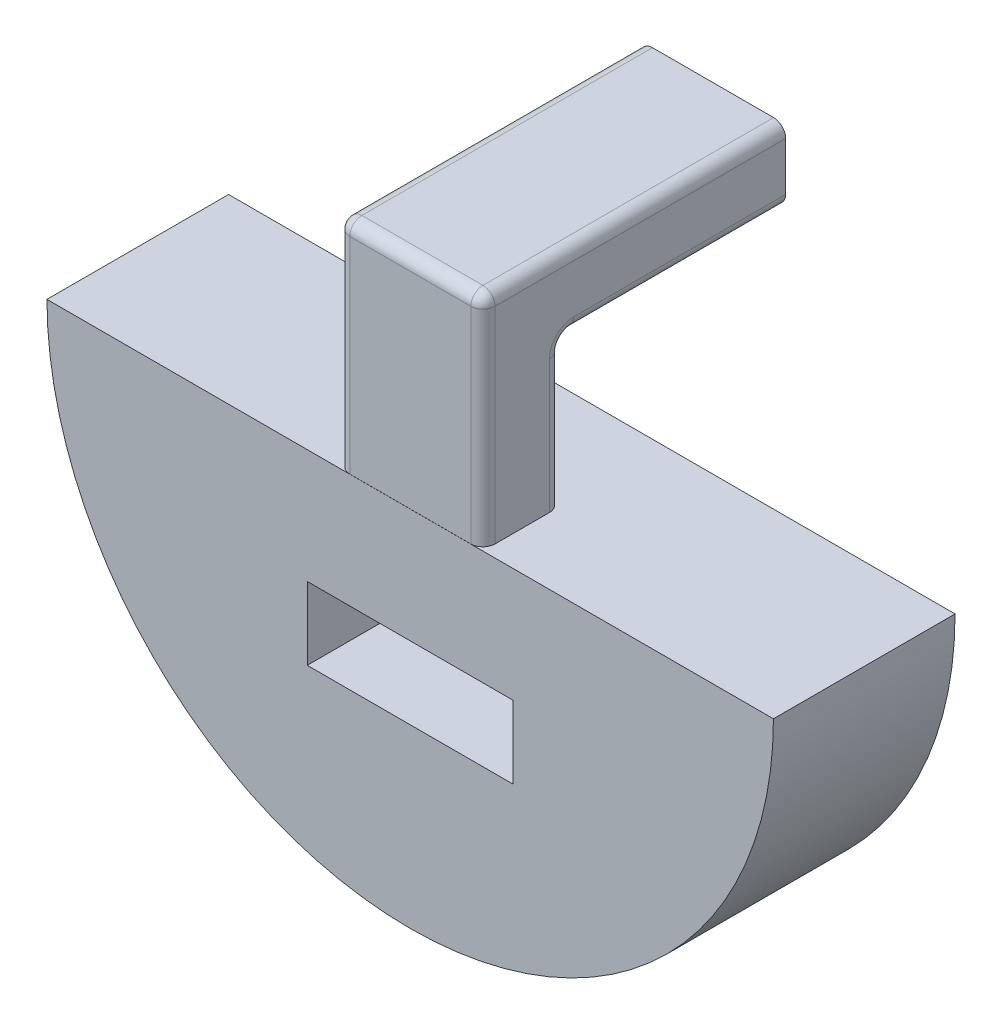
ISO-10303-21;
HEADER;
FILE_DESCRIPTION(('STEP AP214'),'2;1');
FILE_NAME('part.step','',(''),(''),'','','');
FILE_SCHEMA(('AUTOMOTIVE_DESIGN { 1 0 10303 214 1 1 1 1 }'));
ENDSEC;
DATA;
#1=APPLICATION_CONTEXT('core data for automotive mechanical design processes');
#2=APPLICATION_PROTOCOL_DEFINITION('international standard','automotive_design',2000,#1);
#3=PRODUCT_CONTEXT('',#1,'mechanical');
#4=PRODUCT('Part','Part','',(#3));
#5=PRODUCT_RELATED_PRODUCT_CATEGORY('part','',(#4));
#6=PRODUCT_DEFINITION_FORMATION('','',#4);
#7=PRODUCT_DEFINITION_CONTEXT('part definition',#1,'design');
#8=PRODUCT_DEFINITION('design','',#6,#7);
#9=PRODUCT_DEFINITION_SHAPE('','',#8);
#10=(LENGTH_UNIT() NAMED_UNIT(*) SI_UNIT(.MILLI.,.METRE.));
#11=(NAMED_UNIT(*) PLANE_ANGLE_UNIT() SI_UNIT($,.RADIAN.));
#12=(NAMED_UNIT(*) SI_UNIT($,.STERADIAN.) SOLID_ANGLE_UNIT());
#13=UNCERTAINTY_MEASURE_WITH_UNIT(LENGTH_MEASURE(1.E-05),#10,'distance_accuracy_value','');
#14=(GEOMETRIC_REPRESENTATION_CONTEXT(3) GLOBAL_UNCERTAINTY_ASSIGNED_CONTEXT((#13)) GLOBAL_UNIT_ASSIGNED_CONTEXT((#10,
#11,#12)) REPRESENTATION_CONTEXT('',''));
#15=CARTESIAN_POINT('',(0.,0.,0.));
#16=DIRECTION('',(0.,0.,1.));
#17=DIRECTION('',(1.,0.,0.));
#18=AXIS2_PLACEMENT_3D('',#15,#16,#17);
#19=CARTESIAN_POINT('',(0.,0.,15.));
#20=DIRECTION('',(0.,0.,1.));
#21=DIRECTION('',(1.,0.,0.));
#22=AXIS2_PLACEMENT_3D('',#19,#20,#21);
#23=PLANE('',#22);
#24=CARTESIAN_POINT('',(0.,0.,15.));
#25=DIRECTION('',(0.,0.,1.));
#26=DIRECTION('',(1.,0.,0.));
#27=AXIS2_PLACEMENT_3D('',#24,#25,#26);
#28=CIRCLE('',#27,30.);
#29=CARTESIAN_POINT('',(-30.,0.,15.));
#30=VERTEX_POINT('',#29);
#31=CARTESIAN_POINT('',(30.,0.,15.));
#32=VERTEX_POINT('',#31);
#33=EDGE_CURVE('E225',#30,#32,#28,.T.);
#34=ORIENTED_EDGE('',*,*,#33,.T.);
#35=DIRECTION('',(-1.,0.,0.));
#36=VECTOR('',#35,1.);
#37=CARTESIAN_POINT('',(30.,0.,15.));
#38=LINE('',#37,#36);
#39=EDGE_CURVE('E228',#32,#30,#38,.T.);
#40=ORIENTED_EDGE('',*,*,#39,.T.);
#41=EDGE_LOOP('',(#34,#40));
#42=FACE_BOUND('',#41,.T.);
#43=DIRECTION('',(-1.,0.,0.));
#44=VECTOR('',#43,1.);
#45=CARTESIAN_POINT('',(-8.5,-9.42663043478261,15.));
#46=LINE('',#45,#44);
#47=CARTESIAN_POINT('',(8.5,-9.4266304347826,15.));
#48=VERTEX_POINT('',#47);
#49=CARTESIAN_POINT('',(-8.5,-9.42663043478261,15.));
#50=VERTEX_POINT('',#49);
#51=EDGE_CURVE('E192',#48,#50,#46,.T.);
#52=ORIENTED_EDGE('',*,*,#51,.F.);
#53=DIRECTION('',(0.,1.,0.));
#54=VECTOR('',#53,1.);
#55=CARTESIAN_POINT('',(8.5,-9.4266304347826,15.));
#56=LINE('',#55,#54);
#57=CARTESIAN_POINT('',(8.5,-15.4266304347826,15.));
#58=VERTEX_POINT('',#57);
#59=EDGE_CURVE('E182',#58,#48,#56,.T.);
#60=ORIENTED_EDGE('',*,*,#59,.F.);
#61=DIRECTION('',(1.,0.,0.));
#62=VECTOR('',#61,1.);
#63=CARTESIAN_POINT('',(-8.5,-15.4266304347826,15.));
#64=LINE('',#63,#62);
#65=CARTESIAN_POINT('',(-8.5,-15.4266304347826,15.));
#66=VERTEX_POINT('',#65);
#67=EDGE_CURVE('E207',#66,#58,#64,.T.);
#68=ORIENTED_EDGE('',*,*,#67,.F.);
#69=DIRECTION('',(0.,-1.,0.));
#70=VECTOR('',#69,1.);
#71=CARTESIAN_POINT('',(-8.5,-9.42663043478261,15.));
#72=LINE('',#71,#70);
#73=EDGE_CURVE('E205',#50,#66,#72,.T.);
#74=ORIENTED_EDGE('',*,*,#73,.F.);
#75=EDGE_LOOP('',(#52,#60,#68,#74));
#76=FACE_BOUND('',#75,.T.);
#77=ADVANCED_FACE('F37',(#42,#76),#23,.T.);
#78=CARTESIAN_POINT('',(0.,0.,0.));
#79=DIRECTION('',(0.,0.,1.));
#80=DIRECTION('',(1.,0.,0.));
#81=AXIS2_PLACEMENT_3D('',#78,#79,#80);
#82=PLANE('',#81);
#83=CARTESIAN_POINT('',(0.,0.,0.));
#84=DIRECTION('',(0.,0.,1.));
#85=DIRECTION('',(1.,0.,0.));
#86=AXIS2_PLACEMENT_3D('',#83,#84,#85);
#87=CIRCLE('',#86,30.);
#88=CARTESIAN_POINT('',(-30.,0.,0.));
#89=VERTEX_POINT('',#88);
#90=CARTESIAN_POINT('',(30.,0.,0.));
#91=VERTEX_POINT('',#90);
#92=EDGE_CURVE('E200',#89,#91,#87,.T.);
#93=ORIENTED_EDGE('',*,*,#92,.F.);
#94=DIRECTION('',(-1.,0.,0.));
#95=VECTOR('',#94,1.);
#96=CARTESIAN_POINT('',(30.,0.,0.));
#97=LINE('',#96,#95);
#98=EDGE_CURVE('E229',#91,#89,#97,.T.);
#99=ORIENTED_EDGE('',*,*,#98,.F.);
#100=EDGE_LOOP('',(#93,#99));
#101=FACE_BOUND('',#100,.T.);
#102=DIRECTION('',(0.,1.,0.));
#103=VECTOR('',#102,1.);
#104=CARTESIAN_POINT('',(8.5,-9.4266304347826,0.));
#105=LINE('',#104,#103);
#106=CARTESIAN_POINT('',(8.5,-15.4266304347826,0.));
#107=VERTEX_POINT('',#106);
#108=CARTESIAN_POINT('',(8.5,-9.4266304347826,0.));
#109=VERTEX_POINT('',#108);
#110=EDGE_CURVE('E212',#107,#109,#105,.T.);
#111=ORIENTED_EDGE('',*,*,#110,.T.);
#112=DIRECTION('',(-1.,0.,0.));
#113=VECTOR('',#112,1.);
#114=CARTESIAN_POINT('',(-8.5,-9.42663043478261,0.));
#115=LINE('',#114,#113);
#116=CARTESIAN_POINT('',(-8.5,-9.42663043478261,0.));
#117=VERTEX_POINT('',#116);
#118=EDGE_CURVE('E199',#109,#117,#115,.T.);
#119=ORIENTED_EDGE('',*,*,#118,.T.);
#120=DIRECTION('',(0.,-1.,0.));
#121=VECTOR('',#120,1.);
#122=CARTESIAN_POINT('',(-8.5,-9.42663043478261,0.));
#123=LINE('',#122,#121);
#124=CARTESIAN_POINT('',(-8.5,-15.4266304347826,0.));
#125=VERTEX_POINT('',#124);
#126=EDGE_CURVE('E216',#117,#125,#123,.T.);
#127=ORIENTED_EDGE('',*,*,#126,.T.);
#128=DIRECTION('',(1.,0.,0.));
#129=VECTOR('',#128,1.);
#130=CARTESIAN_POINT('',(-8.5,-15.4266304347826,0.));
#131=LINE('',#130,#129);
#132=EDGE_CURVE('E193',#125,#107,#131,.T.);
#133=ORIENTED_EDGE('',*,*,#132,.T.);
#134=EDGE_LOOP('',(#111,#119,#127,#133));
#135=FACE_BOUND('',#134,.T.);
#136=ADVANCED_FACE('F445',(#101,#135),#82,.F.);
#137=CARTESIAN_POINT('',(0.,0.,15.));
#138=DIRECTION('',(0.,0.,-1.));
#139=DIRECTION('',(-1.,0.,0.));
#140=AXIS2_PLACEMENT_3D('',#137,#138,#139);
#141=CYLINDRICAL_SURFACE('',#140,30.);
#142=ORIENTED_EDGE('',*,*,#92,.T.);
#143=DIRECTION('',(0.,0.,-1.));
#144=VECTOR('',#143,1.);
#145=CARTESIAN_POINT('',(30.,0.,15.));
#146=LINE('',#145,#144);
#147=EDGE_CURVE('E237',#32,#91,#146,.T.);
#148=ORIENTED_EDGE('',*,*,#147,.F.);
#149=ORIENTED_EDGE('',*,*,#33,.F.);
#150=DIRECTION('',(0.,0.,-1.));
#151=VECTOR('',#150,1.);
#152=CARTESIAN_POINT('',(-30.,0.,15.));
#153=LINE('',#152,#151);
#154=EDGE_CURVE('E231',#30,#89,#153,.T.);
#155=ORIENTED_EDGE('',*,*,#154,.T.);
#156=EDGE_LOOP('',(#142,#148,#149,#155));
#157=FACE_BOUND('',#156,.T.);
#158=ADVANCED_FACE('F451',(#157),#141,.T.);
#159=CARTESIAN_POINT('',(30.,0.,15.));
#160=DIRECTION('',(0.,-1.,0.));
#161=DIRECTION('',(0.,0.,-1.));
#162=AXIS2_PLACEMENT_3D('',#159,#160,#161);
#163=PLANE('',#162);
#164=DIRECTION('',(0.,0.,-1.));
#165=VECTOR('',#164,1.);
#166=CARTESIAN_POINT('',(6.,0.,15.));
#167=LINE('',#166,#165);
#168=CARTESIAN_POINT('',(6.,0.,13.9904366713208));
#169=VERTEX_POINT('',#168);
#170=CARTESIAN_POINT('',(6.,0.,9.49817360608599));
#171=VERTEX_POINT('',#170);
#172=EDGE_CURVE('E240',#169,#171,#167,.T.);
#173=ORIENTED_EDGE('',*,*,#172,.F.);
#174=CARTESIAN_POINT('',(5.,0.,13.9904366713208));
#175=DIRECTION('',(0.,-1.,0.));
#176=DIRECTION('',(0.,0.,-1.));
#177=AXIS2_PLACEMENT_3D('',#174,#175,#176);
#178=CIRCLE('',#177,1.);
#179=CARTESIAN_POINT('',(5.,0.,14.9904366713208));
#180=VERTEX_POINT('',#179);
#181=EDGE_CURVE('E284',#169,#180,#178,.T.);
#182=ORIENTED_EDGE('',*,*,#181,.T.);
#183=DIRECTION('',(-1.,0.,0.));
#184=VECTOR('',#183,1.);
#185=CARTESIAN_POINT('',(30.,0.,14.9904366713208));
#186=LINE('',#185,#184);
#187=CARTESIAN_POINT('',(-5.,0.,14.9904366713208));
#188=VERTEX_POINT('',#187);
#189=EDGE_CURVE('E246',#180,#188,#186,.T.);
#190=ORIENTED_EDGE('',*,*,#189,.T.);
#191=CARTESIAN_POINT('',(-5.,0.,13.9904366713208));
#192=DIRECTION('',(0.,-1.,0.));
#193=DIRECTION('',(0.,0.,-1.));
#194=AXIS2_PLACEMENT_3D('',#191,#192,#193);
#195=CIRCLE('',#194,1.);
#196=CARTESIAN_POINT('',(-6.,0.,13.9904366713208));
#197=VERTEX_POINT('',#196);
#198=EDGE_CURVE('E257',#188,#197,#195,.T.);
#199=ORIENTED_EDGE('',*,*,#198,.T.);
#200=DIRECTION('',(0.,0.,-1.));
#201=VECTOR('',#200,1.);
#202=CARTESIAN_POINT('',(-6.,0.,15.));
#203=LINE('',#202,#201);
#204=CARTESIAN_POINT('',(-6.,0.,9.49817360608599));
#205=VERTEX_POINT('',#204);
#206=EDGE_CURVE('E248',#197,#205,#203,.T.);
#207=ORIENTED_EDGE('',*,*,#206,.T.);
#208=CARTESIAN_POINT('',(-5.,0.,9.49817360608599));
#209=DIRECTION('',(0.,-1.,0.));
#210=DIRECTION('',(0.,0.,-1.));
#211=AXIS2_PLACEMENT_3D('',#208,#209,#210);
#212=CIRCLE('',#211,1.);
#213=CARTESIAN_POINT('',(-5.,0.,8.49817360608598));
#214=VERTEX_POINT('',#213);
#215=EDGE_CURVE('E11',#205,#214,#212,.T.);
#216=ORIENTED_EDGE('',*,*,#215,.T.);
#217=DIRECTION('',(1.,0.,0.));
#218=VECTOR('',#217,1.);
#219=CARTESIAN_POINT('',(30.,0.,8.49817360608598));
#220=LINE('',#219,#218);
#221=CARTESIAN_POINT('',(5.,0.,8.49817360608598));
#222=VERTEX_POINT('',#221);
#223=EDGE_CURVE('E243',#214,#222,#220,.T.);
#224=ORIENTED_EDGE('',*,*,#223,.T.);
#225=CARTESIAN_POINT('',(5.,0.,9.49817360608599));
#226=DIRECTION('',(0.,-1.,0.));
#227=DIRECTION('',(0.,0.,-1.));
#228=AXIS2_PLACEMENT_3D('',#225,#226,#227);
#229=CIRCLE('',#228,1.);
#230=EDGE_CURVE('E46',#222,#171,#229,.T.);
#231=ORIENTED_EDGE('',*,*,#230,.T.);
#232=EDGE_LOOP('',(#173,#182,#190,#199,#207,#216,#224,#231));
#233=FACE_BOUND('',#232,.T.);
#234=ORIENTED_EDGE('',*,*,#98,.T.);
#235=ORIENTED_EDGE('',*,*,#154,.F.);
#236=ORIENTED_EDGE('',*,*,#39,.F.);
#237=ORIENTED_EDGE('',*,*,#147,.T.);
#238=EDGE_LOOP('',(#234,#235,#236,#237));
#239=FACE_BOUND('',#238,.T.);
#240=ADVANCED_FACE('F367',(#233,#239),#163,.F.);
#241=CARTESIAN_POINT('',(8.5,-9.4266304347826,15.));
#242=DIRECTION('',(-1.,0.,0.));
#243=DIRECTION('',(0.,0.,1.));
#244=AXIS2_PLACEMENT_3D('',#241,#242,#243);
#245=PLANE('',#244);
#246=ORIENTED_EDGE('',*,*,#110,.F.);
#247=DIRECTION('',(0.,0.,-1.));
#248=VECTOR('',#247,1.);
#249=CARTESIAN_POINT('',(8.5,-15.4266304347826,15.));
#250=LINE('',#249,#248);
#251=EDGE_CURVE('E188',#58,#107,#250,.T.);
#252=ORIENTED_EDGE('',*,*,#251,.F.);
#253=ORIENTED_EDGE('',*,*,#59,.T.);
#254=DIRECTION('',(0.,0.,-1.));
#255=VECTOR('',#254,1.);
#256=CARTESIAN_POINT('',(8.5,-9.4266304347826,15.));
#257=LINE('',#256,#255);
#258=EDGE_CURVE('E185',#48,#109,#257,.T.);
#259=ORIENTED_EDGE('',*,*,#258,.T.);
#260=EDGE_LOOP('',(#246,#252,#253,#259));
#261=FACE_BOUND('',#260,.T.);
#262=ADVANCED_FACE('F184',(#261),#245,.T.);
#263=CARTESIAN_POINT('',(-8.5,-9.42663043478261,15.));
#264=DIRECTION('',(0.,-1.,0.));
#265=DIRECTION('',(1.,0.,0.));
#266=AXIS2_PLACEMENT_3D('',#263,#264,#265);
#267=PLANE('',#266);
#268=ORIENTED_EDGE('',*,*,#118,.F.);
#269=ORIENTED_EDGE('',*,*,#258,.F.);
#270=ORIENTED_EDGE('',*,*,#51,.T.);
#271=DIRECTION('',(0.,0.,-1.));
#272=VECTOR('',#271,1.);
#273=CARTESIAN_POINT('',(-8.5,-9.42663043478261,15.));
#274=LINE('',#273,#272);
#275=EDGE_CURVE('E201',#50,#117,#274,.T.);
#276=ORIENTED_EDGE('',*,*,#275,.T.);
#277=EDGE_LOOP('',(#268,#269,#270,#276));
#278=FACE_BOUND('',#277,.T.);
#279=ADVANCED_FACE('F196',(#278),#267,.T.);
#280=CARTESIAN_POINT('',(-8.5,-9.42663043478261,15.));
#281=DIRECTION('',(1.,0.,0.));
#282=DIRECTION('',(0.,0.,-1.));
#283=AXIS2_PLACEMENT_3D('',#280,#281,#282);
#284=PLANE('',#283);
#285=ORIENTED_EDGE('',*,*,#126,.F.);
#286=ORIENTED_EDGE('',*,*,#275,.F.);
#287=ORIENTED_EDGE('',*,*,#73,.T.);
#288=DIRECTION('',(0.,0.,-1.));
#289=VECTOR('',#288,1.);
#290=CARTESIAN_POINT('',(-8.5,-15.4266304347826,15.));
#291=LINE('',#290,#289);
#292=EDGE_CURVE('E222',#66,#125,#291,.T.);
#293=ORIENTED_EDGE('',*,*,#292,.T.);
#294=EDGE_LOOP('',(#285,#286,#287,#293));
#295=FACE_BOUND('',#294,.T.);
#296=ADVANCED_FACE('F578',(#295),#284,.T.);
#297=CARTESIAN_POINT('',(-8.5,-15.4266304347826,15.));
#298=DIRECTION('',(0.,1.,0.));
#299=DIRECTION('',(-1.,0.,0.));
#300=AXIS2_PLACEMENT_3D('',#297,#298,#299);
#301=PLANE('',#300);
#302=ORIENTED_EDGE('',*,*,#132,.F.);
#303=ORIENTED_EDGE('',*,*,#292,.F.);
#304=ORIENTED_EDGE('',*,*,#67,.T.);
#305=ORIENTED_EDGE('',*,*,#251,.T.);
#306=EDGE_LOOP('',(#302,#303,#304,#305));
#307=FACE_BOUND('',#306,.T.);
#308=ADVANCED_FACE('F584',(#307),#301,.T.);
#309=CARTESIAN_POINT('',(-6.,-0.00212283025659841,14.9904366713208));
#310=DIRECTION('',(0.,0.,1.));
#311=DIRECTION('',(0.,-1.,0.));
#312=AXIS2_PLACEMENT_3D('',#309,#310,#311);
#313=PLANE('',#312);
#314=DIRECTION('',(0.,-1.,0.));
#315=VECTOR('',#314,1.);
#316=CARTESIAN_POINT('',(5.,17.9978771697434,14.9904366713208));
#317=LINE('',#316,#315);
#318=CARTESIAN_POINT('',(5.,16.9978771697434,14.9904366713208));
#319=VERTEX_POINT('',#318);
#320=EDGE_CURVE('E266',#180,#319,#317,.F.);
#321=ORIENTED_EDGE('',*,*,#320,.T.);
#322=DIRECTION('',(1.,0.,0.));
#323=VECTOR('',#322,1.);
#324=CARTESIAN_POINT('',(-6.,16.9978771697434,14.9904366713208));
#325=LINE('',#324,#323);
#326=CARTESIAN_POINT('',(-5.,16.9978771697434,14.9904366713208));
#327=VERTEX_POINT('',#326);
#328=EDGE_CURVE('E268',#319,#327,#325,.F.);
#329=ORIENTED_EDGE('',*,*,#328,.T.);
#330=DIRECTION('',(0.,-1.,0.));
#331=VECTOR('',#330,1.);
#332=CARTESIAN_POINT('',(-5.,-0.00212283025659841,14.9904366713208));
#333=LINE('',#332,#331);
#334=EDGE_CURVE('E251',#327,#188,#333,.T.);
#335=ORIENTED_EDGE('',*,*,#334,.T.);
#336=ORIENTED_EDGE('',*,*,#189,.F.);
#337=EDGE_LOOP('',(#321,#329,#335,#336));
#338=FACE_BOUND('',#337,.T.);
#339=ADVANCED_FACE('F418',(#338),#313,.T.);
#340=CARTESIAN_POINT('',(-6.,11.9978771697434,8.49817360608598));
#341=DIRECTION('',(0.,0.,-1.));
#342=DIRECTION('',(-1.,0.,0.));
#343=AXIS2_PLACEMENT_3D('',#340,#341,#342);
#344=PLANE('',#343);
#345=DIRECTION('',(1.,0.,0.));
#346=VECTOR('',#345,1.);
#347=CARTESIAN_POINT('',(6.,10.9978771697434,8.49817360608598));
#348=LINE('',#347,#346);
#349=CARTESIAN_POINT('',(-5.,10.9978771697434,8.49817360608598));
#350=VERTEX_POINT('',#349);
#351=CARTESIAN_POINT('',(5.,10.9978771697434,8.49817360608598));
#352=VERTEX_POINT('',#351);
#353=EDGE_CURVE('E54',#350,#352,#348,.T.);
#354=ORIENTED_EDGE('',*,*,#353,.T.);
#355=DIRECTION('',(0.,1.,0.));
#356=VECTOR('',#355,1.);
#357=CARTESIAN_POINT('',(5.,0.,8.49817360608598));
#358=LINE('',#357,#356);
#359=EDGE_CURVE('E328',#352,#222,#358,.F.);
#360=ORIENTED_EDGE('',*,*,#359,.T.);
#361=ORIENTED_EDGE('',*,*,#223,.F.);
#362=DIRECTION('',(0.,1.,0.));
#363=VECTOR('',#362,1.);
#364=CARTESIAN_POINT('',(-5.,11.9978771697434,8.49817360608598));
#365=LINE('',#364,#363);
#366=EDGE_CURVE('E59',#214,#350,#365,.T.);
#367=ORIENTED_EDGE('',*,*,#366,.T.);
#368=EDGE_LOOP('',(#354,#360,#361,#367));
#369=FACE_BOUND('',#368,.T.);
#370=ADVANCED_FACE('F364',(#369),#344,.T.);
#371=CARTESIAN_POINT('',(-6.,0.,0.));
#372=DIRECTION('',(-1.,0.,0.));
#373=DIRECTION('',(0.,0.,1.));
#374=AXIS2_PLACEMENT_3D('',#371,#372,#373);
#375=PLANE('',#374);
#376=DIRECTION('',(0.,1.,0.));
#377=VECTOR('',#376,1.);
#378=CARTESIAN_POINT('',(-6.,17.9978771697434,-10.0095633286792));
#379=LINE('',#378,#377);
#380=CARTESIAN_POINT('',(-6.,12.9978771697434,-10.0095633286792));
#381=VERTEX_POINT('',#380);
#382=CARTESIAN_POINT('',(-6.,16.9978771697434,-10.0095633286792));
#383=VERTEX_POINT('',#382);
#384=EDGE_CURVE('E378',#381,#383,#379,.T.);
#385=ORIENTED_EDGE('',*,*,#384,.F.);
#386=DIRECTION('',(0.,0.,-1.));
#387=VECTOR('',#386,1.);
#388=CARTESIAN_POINT('',(-6.,12.9978771697434,0.));
#389=LINE('',#388,#387);
#390=CARTESIAN_POINT('',(-6.,12.9978771697434,7.49817360608598));
#391=VERTEX_POINT('',#390);
#392=EDGE_CURVE('E324',#381,#391,#389,.F.);
#393=ORIENTED_EDGE('',*,*,#392,.T.);
#394=CARTESIAN_POINT('',(-6.,10.9978771697434,7.49817360608598));
#395=DIRECTION('',(-1.,0.,0.));
#396=DIRECTION('',(0.,0.,1.));
#397=AXIS2_PLACEMENT_3D('',#394,#395,#396);
#398=CIRCLE('',#397,2.);
#399=CARTESIAN_POINT('',(-6.,10.9978771697434,9.49817360608599));
#400=VERTEX_POINT('',#399);
#401=EDGE_CURVE('E321',#400,#391,#398,.T.);
#402=ORIENTED_EDGE('',*,*,#401,.F.);
#403=DIRECTION('',(0.,1.,0.));
#404=VECTOR('',#403,1.);
#405=CARTESIAN_POINT('',(-6.,0.,9.49817360608599));
#406=LINE('',#405,#404);
#407=EDGE_CURVE('E319',#400,#205,#406,.F.);
#408=ORIENTED_EDGE('',*,*,#407,.T.);
#409=ORIENTED_EDGE('',*,*,#206,.F.);
#410=DIRECTION('',(0.,-1.,0.));
#411=VECTOR('',#410,1.);
#412=CARTESIAN_POINT('',(-6.,0.,13.9904366713208));
#413=LINE('',#412,#411);
#414=CARTESIAN_POINT('',(-6.,16.9978771697434,13.9904366713208));
#415=VERTEX_POINT('',#414);
#416=EDGE_CURVE('E254',#197,#415,#413,.F.);
#417=ORIENTED_EDGE('',*,*,#416,.T.);
#418=DIRECTION('',(0.,0.,1.));
#419=VECTOR('',#418,1.);
#420=CARTESIAN_POINT('',(-6.,16.9978771697434,0.));
#421=LINE('',#420,#419);
#422=EDGE_CURVE('E272',#415,#383,#421,.F.);
#423=ORIENTED_EDGE('',*,*,#422,.T.);
#424=EDGE_LOOP('',(#385,#393,#402,#408,#409,#417,#423));
#425=FACE_BOUND('',#424,.T.);
#426=ADVANCED_FACE('F376',(#425),#375,.T.);
#427=CARTESIAN_POINT('',(6.,0.,0.));
#428=DIRECTION('',(-1.,0.,0.));
#429=DIRECTION('',(0.,0.,1.));
#430=AXIS2_PLACEMENT_3D('',#427,#428,#429);
#431=PLANE('',#430);
#432=CARTESIAN_POINT('',(6.,10.9978771697434,7.49817360608598));
#433=DIRECTION('',(-1.,0.,0.));
#434=DIRECTION('',(0.,0.,1.));
#435=AXIS2_PLACEMENT_3D('',#432,#433,#434);
#436=CIRCLE('',#435,2.);
#437=CARTESIAN_POINT('',(6.,12.9978771697434,7.49817360608598));
#438=VERTEX_POINT('',#437);
#439=CARTESIAN_POINT('',(6.,10.9978771697434,9.49817360608599));
#440=VERTEX_POINT('',#439);
#441=EDGE_CURVE('E286',#438,#440,#436,.F.);
#442=ORIENTED_EDGE('',*,*,#441,.F.);
#443=DIRECTION('',(0.,0.,-1.));
#444=VECTOR('',#443,1.);
#445=CARTESIAN_POINT('',(6.,12.9978771697434,-10.0095633286792));
#446=LINE('',#445,#444);
#447=CARTESIAN_POINT('',(6.,12.9978771697434,-10.0095633286792));
#448=VERTEX_POINT('',#447);
#449=EDGE_CURVE('E306',#438,#448,#446,.T.);
#450=ORIENTED_EDGE('',*,*,#449,.T.);
#451=DIRECTION('',(0.,1.,0.));
#452=VECTOR('',#451,1.);
#453=CARTESIAN_POINT('',(6.,17.9978771697434,-10.0095633286792));
#454=LINE('',#453,#452);
#455=CARTESIAN_POINT('',(6.,16.9978771697434,-10.0095633286792));
#456=VERTEX_POINT('',#455);
#457=EDGE_CURVE('E301',#448,#456,#454,.T.);
#458=ORIENTED_EDGE('',*,*,#457,.T.);
#459=DIRECTION('',(0.,0.,1.));
#460=VECTOR('',#459,1.);
#461=CARTESIAN_POINT('',(6.,16.9978771697434,14.9904366713208));
#462=LINE('',#461,#460);
#463=CARTESIAN_POINT('',(6.,16.9978771697434,13.9904366713208));
#464=VERTEX_POINT('',#463);
#465=EDGE_CURVE('E282',#456,#464,#462,.T.);
#466=ORIENTED_EDGE('',*,*,#465,.T.);
#467=DIRECTION('',(0.,-1.,0.));
#468=VECTOR('',#467,1.);
#469=CARTESIAN_POINT('',(6.,0.,13.9904366713208));
#470=LINE('',#469,#468);
#471=EDGE_CURVE('E280',#464,#169,#470,.T.);
#472=ORIENTED_EDGE('',*,*,#471,.T.);
#473=ORIENTED_EDGE('',*,*,#172,.T.);
#474=DIRECTION('',(0.,1.,0.));
#475=VECTOR('',#474,1.);
#476=CARTESIAN_POINT('',(6.,11.9978771697434,9.49817360608599));
#477=LINE('',#476,#475);
#478=EDGE_CURVE('E304',#171,#440,#477,.T.);
#479=ORIENTED_EDGE('',*,*,#478,.T.);
#480=EDGE_LOOP('',(#442,#450,#458,#466,#472,#473,#479));
#481=FACE_BOUND('',#480,.T.);
#482=ADVANCED_FACE('F393',(#481),#431,.F.);
#483=CARTESIAN_POINT('',(-6.,17.9978771697434,14.9904366713208));
#484=DIRECTION('',(0.,1.,0.));
#485=DIRECTION('',(0.,0.,1.));
#486=AXIS2_PLACEMENT_3D('',#483,#484,#485);
#487=PLANE('',#486);
#488=DIRECTION('',(1.,0.,0.));
#489=VECTOR('',#488,1.);
#490=CARTESIAN_POINT('',(-6.,17.9978771697434,-10.0095633286792));
#491=LINE('',#490,#489);
#492=CARTESIAN_POINT('',(-5.,17.9978771697434,-10.0095633286792));
#493=VERTEX_POINT('',#492);
#494=CARTESIAN_POINT('',(5.,17.9978771697434,-10.0095633286792));
#495=VERTEX_POINT('',#494);
#496=EDGE_CURVE('E214',#493,#495,#491,.T.);
#497=ORIENTED_EDGE('',*,*,#496,.F.);
#498=DIRECTION('',(0.,0.,1.));
#499=VECTOR('',#498,1.);
#500=CARTESIAN_POINT('',(-5.,17.9978771697434,14.9904366713208));
#501=LINE('',#500,#499);
#502=CARTESIAN_POINT('',(-5.,17.9978771697434,13.9904366713208));
#503=VERTEX_POINT('',#502);
#504=EDGE_CURVE('E264',#493,#503,#501,.T.);
#505=ORIENTED_EDGE('',*,*,#504,.T.);
#506=DIRECTION('',(1.,0.,0.));
#507=VECTOR('',#506,1.);
#508=CARTESIAN_POINT('',(-6.,17.9978771697434,13.9904366713208));
#509=LINE('',#508,#507);
#510=CARTESIAN_POINT('',(5.,17.9978771697434,13.9904366713208));
#511=VERTEX_POINT('',#510);
#512=EDGE_CURVE('E261',#503,#511,#509,.T.);
#513=ORIENTED_EDGE('',*,*,#512,.T.);
#514=DIRECTION('',(0.,0.,1.));
#515=VECTOR('',#514,1.);
#516=CARTESIAN_POINT('',(5.,17.9978771697434,-10.0095633286792));
#517=LINE('',#516,#515);
#518=EDGE_CURVE('E259',#511,#495,#517,.F.);
#519=ORIENTED_EDGE('',*,*,#518,.T.);
#520=EDGE_LOOP('',(#497,#505,#513,#519));
#521=FACE_BOUND('',#520,.T.);
#522=ADVANCED_FACE('F433',(#521),#487,.T.);
#523=CARTESIAN_POINT('',(-6.,17.9978771697434,-10.0095633286792));
#524=DIRECTION('',(0.,0.,-1.));
#525=DIRECTION('',(-1.,0.,0.));
#526=AXIS2_PLACEMENT_3D('',#523,#524,#525);
#527=PLANE('',#526);
#528=ORIENTED_EDGE('',*,*,#457,.F.);
#529=CARTESIAN_POINT('',(5.,12.9978771697434,-10.0095633286792));
#530=DIRECTION('',(0.,0.,-1.));
#531=DIRECTION('',(-1.,0.,0.));
#532=AXIS2_PLACEMENT_3D('',#529,#530,#531);
#533=CIRCLE('',#532,1.);
#534=CARTESIAN_POINT('',(5.,11.9978771697434,-10.0095633286792));
#535=VERTEX_POINT('',#534);
#536=EDGE_CURVE('E311',#448,#535,#533,.T.);
#537=ORIENTED_EDGE('',*,*,#536,.T.);
#538=DIRECTION('',(1.,0.,0.));
#539=VECTOR('',#538,1.);
#540=CARTESIAN_POINT('',(-6.,11.9978771697434,-10.0095633286792));
#541=LINE('',#540,#539);
#542=CARTESIAN_POINT('',(-5.,11.9978771697434,-10.0095633286792));
#543=VERTEX_POINT('',#542);
#544=EDGE_CURVE('E385',#543,#535,#541,.T.);
#545=ORIENTED_EDGE('',*,*,#544,.F.);
#546=CARTESIAN_POINT('',(-5.,12.9978771697434,-10.0095633286792));
#547=DIRECTION('',(0.,0.,-1.));
#548=DIRECTION('',(-1.,0.,0.));
#549=AXIS2_PLACEMENT_3D('',#546,#547,#548);
#550=CIRCLE('',#549,1.);
#551=EDGE_CURVE('E309',#543,#381,#550,.T.);
#552=ORIENTED_EDGE('',*,*,#551,.T.);
#553=ORIENTED_EDGE('',*,*,#384,.T.);
#554=CARTESIAN_POINT('',(-5.,16.9978771697434,-10.0095633286792));
#555=DIRECTION('',(0.,0.,-1.));
#556=DIRECTION('',(-1.,0.,0.));
#557=AXIS2_PLACEMENT_3D('',#554,#555,#556);
#558=CIRCLE('',#557,1.);
#559=EDGE_CURVE('E278',#383,#493,#558,.T.);
#560=ORIENTED_EDGE('',*,*,#559,.T.);
#561=ORIENTED_EDGE('',*,*,#496,.T.);
#562=CARTESIAN_POINT('',(5.,16.9978771697434,-10.0095633286792));
#563=DIRECTION('',(0.,0.,-1.));
#564=DIRECTION('',(-1.,0.,0.));
#565=AXIS2_PLACEMENT_3D('',#562,#563,#564);
#566=CIRCLE('',#565,1.);
#567=EDGE_CURVE('E275',#495,#456,#566,.T.);
#568=ORIENTED_EDGE('',*,*,#567,.T.);
#569=EDGE_LOOP('',(#528,#537,#545,#552,#553,#560,#561,#568));
#570=FACE_BOUND('',#569,.T.);
#571=ADVANCED_FACE('F383',(#570),#527,.T.);
#572=CARTESIAN_POINT('',(-6.,11.9978771697434,-10.0095633286792));
#573=DIRECTION('',(0.,-1.,0.));
#574=DIRECTION('',(0.,0.,-1.));
#575=AXIS2_PLACEMENT_3D('',#572,#573,#574);
#576=PLANE('',#575);
#577=ORIENTED_EDGE('',*,*,#544,.T.);
#578=DIRECTION('',(0.,0.,-1.));
#579=VECTOR('',#578,1.);
#580=CARTESIAN_POINT('',(5.,11.9978771697434,8.49817360608598));
#581=LINE('',#580,#579);
#582=CARTESIAN_POINT('',(5.,11.9978771697434,7.49817360608598));
#583=VERTEX_POINT('',#582);
#584=EDGE_CURVE('E317',#535,#583,#581,.F.);
#585=ORIENTED_EDGE('',*,*,#584,.T.);
#586=DIRECTION('',(1.,0.,0.));
#587=VECTOR('',#586,1.);
#588=CARTESIAN_POINT('',(-6.,11.9978771697434,7.49817360608598));
#589=LINE('',#588,#587);
#590=CARTESIAN_POINT('',(-5.,11.9978771697434,7.49817360608598));
#591=VERTEX_POINT('',#590);
#592=EDGE_CURVE('E313',#583,#591,#589,.F.);
#593=ORIENTED_EDGE('',*,*,#592,.T.);
#594=DIRECTION('',(0.,0.,-1.));
#595=VECTOR('',#594,1.);
#596=CARTESIAN_POINT('',(-5.,11.9978771697434,-10.0095633286792));
#597=LINE('',#596,#595);
#598=EDGE_CURVE('E315',#591,#543,#597,.T.);
#599=ORIENTED_EDGE('',*,*,#598,.T.);
#600=EDGE_LOOP('',(#577,#585,#593,#599));
#601=FACE_BOUND('',#600,.T.);
#602=ADVANCED_FACE('F440',(#601),#576,.T.);
#603=CARTESIAN_POINT('',(-5.,-0.0021228302565986,13.9904366713208));
#604=DIRECTION('',(0.,-1.,0.));
#605=DIRECTION('',(0.,0.,-1.));
#606=AXIS2_PLACEMENT_3D('',#603,#604,#605);
#607=CYLINDRICAL_SURFACE('',#606,1.);
#608=ORIENTED_EDGE('',*,*,#334,.F.);
#609=CARTESIAN_POINT('',(-5.,16.9978771697434,13.9904366713208));
#610=DIRECTION('',(0.,-1.,0.));
#611=DIRECTION('',(0.,0.,-1.));
#612=AXIS2_PLACEMENT_3D('',#609,#610,#611);
#613=CIRCLE('',#612,1.);
#614=EDGE_CURVE('E270',#327,#415,#613,.T.);
#615=ORIENTED_EDGE('',*,*,#614,.T.);
#616=ORIENTED_EDGE('',*,*,#416,.F.);
#617=ORIENTED_EDGE('',*,*,#198,.F.);
#618=EDGE_LOOP('',(#608,#615,#616,#617));
#619=FACE_BOUND('',#618,.T.);
#620=ADVANCED_FACE('F423',(#619),#607,.T.);
#621=CARTESIAN_POINT('',(-5.,16.9978771697434,14.9904366713208));
#622=DIRECTION('',(0.,0.,1.));
#623=DIRECTION('',(1.,0.,0.));
#624=AXIS2_PLACEMENT_3D('',#621,#622,#623);
#625=CYLINDRICAL_SURFACE('',#624,1.);
#626=ORIENTED_EDGE('',*,*,#559,.F.);
#627=ORIENTED_EDGE('',*,*,#422,.F.);
#628=CARTESIAN_POINT('',(-5.,16.9978771697434,13.9904366713208));
#629=DIRECTION('',(0.,0.,1.));
#630=DIRECTION('',(1.,0.,0.));
#631=AXIS2_PLACEMENT_3D('',#628,#629,#630);
#632=CIRCLE('',#631,1.);
#633=EDGE_CURVE('E298',#503,#415,#632,.T.);
#634=ORIENTED_EDGE('',*,*,#633,.F.);
#635=ORIENTED_EDGE('',*,*,#504,.F.);
#636=EDGE_LOOP('',(#626,#627,#634,#635));
#637=FACE_BOUND('',#636,.T.);
#638=ADVANCED_FACE('F431',(#637),#625,.T.);
#639=CARTESIAN_POINT('',(5.,16.9978771697434,0.));
#640=DIRECTION('',(0.,0.,-1.));
#641=DIRECTION('',(-1.,0.,0.));
#642=AXIS2_PLACEMENT_3D('',#639,#640,#641);
#643=CYLINDRICAL_SURFACE('',#642,1.);
#644=ORIENTED_EDGE('',*,*,#567,.F.);
#645=ORIENTED_EDGE('',*,*,#518,.F.);
#646=CARTESIAN_POINT('',(5.,16.9978771697434,13.9904366713208));
#647=DIRECTION('',(0.,0.,1.));
#648=DIRECTION('',(1.,0.,0.));
#649=AXIS2_PLACEMENT_3D('',#646,#647,#648);
#650=CIRCLE('',#649,1.);
#651=EDGE_CURVE('E295',#464,#511,#650,.T.);
#652=ORIENTED_EDGE('',*,*,#651,.F.);
#653=ORIENTED_EDGE('',*,*,#465,.F.);
#654=EDGE_LOOP('',(#644,#645,#652,#653));
#655=FACE_BOUND('',#654,.T.);
#656=ADVANCED_FACE('F402',(#655),#643,.T.);
#657=CARTESIAN_POINT('',(5.,0.,13.9904366713208));
#658=DIRECTION('',(0.,1.,0.));
#659=DIRECTION('',(0.,0.,1.));
#660=AXIS2_PLACEMENT_3D('',#657,#658,#659);
#661=CYLINDRICAL_SURFACE('',#660,1.);
#662=ORIENTED_EDGE('',*,*,#181,.F.);
#663=ORIENTED_EDGE('',*,*,#471,.F.);
#664=CARTESIAN_POINT('',(5.,16.9978771697434,13.9904366713208));
#665=DIRECTION('',(0.,1.,0.));
#666=DIRECTION('',(0.,0.,1.));
#667=AXIS2_PLACEMENT_3D('',#664,#665,#666);
#668=CIRCLE('',#667,1.);
#669=EDGE_CURVE('E292',#319,#464,#668,.T.);
#670=ORIENTED_EDGE('',*,*,#669,.F.);
#671=ORIENTED_EDGE('',*,*,#320,.F.);
#672=EDGE_LOOP('',(#662,#663,#670,#671));
#673=FACE_BOUND('',#672,.T.);
#674=ADVANCED_FACE('F411',(#673),#661,.T.);
#675=CARTESIAN_POINT('',(-5.,16.9978771697434,13.9904366713208));
#676=DIRECTION('',(0.,1.,0.));
#677=DIRECTION('',(0.,0.,1.));
#678=AXIS2_PLACEMENT_3D('',#675,#676,#677);
#679=SPHERICAL_SURFACE('',#678,1.);
#680=ORIENTED_EDGE('',*,*,#633,.T.);
#681=ORIENTED_EDGE('',*,*,#614,.F.);
#682=CARTESIAN_POINT('',(-5.,16.9978771697434,13.9904366713208));
#683=DIRECTION('',(1.,0.,0.));
#684=DIRECTION('',(0.,0.,-1.));
#685=AXIS2_PLACEMENT_3D('',#682,#683,#684);
#686=CIRCLE('',#685,1.);
#687=EDGE_CURVE('E289',#503,#327,#686,.T.);
#688=ORIENTED_EDGE('',*,*,#687,.F.);
#689=EDGE_LOOP('',(#680,#681,#688));
#690=FACE_BOUND('',#689,.T.);
#691=ADVANCED_FACE('F425',(#690),#679,.T.);
#692=CARTESIAN_POINT('',(5.,16.9978771697434,13.9904366713208));
#693=DIRECTION('',(0.,0.,1.));
#694=DIRECTION('',(1.,0.,0.));
#695=AXIS2_PLACEMENT_3D('',#692,#693,#694);
#696=SPHERICAL_SURFACE('',#695,1.);
#697=ORIENTED_EDGE('',*,*,#669,.T.);
#698=ORIENTED_EDGE('',*,*,#651,.T.);
#699=CARTESIAN_POINT('',(5.,16.9978771697434,13.9904366713208));
#700=DIRECTION('',(1.,0.,0.));
#701=DIRECTION('',(0.,0.,-1.));
#702=AXIS2_PLACEMENT_3D('',#699,#700,#701);
#703=CIRCLE('',#702,1.);
#704=EDGE_CURVE('E287',#319,#511,#703,.F.);
#705=ORIENTED_EDGE('',*,*,#704,.F.);
#706=EDGE_LOOP('',(#697,#698,#705));
#707=FACE_BOUND('',#706,.T.);
#708=ADVANCED_FACE('F406',(#707),#696,.T.);
#709=CARTESIAN_POINT('',(-6.,16.9978771697434,13.9904366713208));
#710=DIRECTION('',(1.,0.,0.));
#711=DIRECTION('',(0.,0.,-1.));
#712=AXIS2_PLACEMENT_3D('',#709,#710,#711);
#713=CYLINDRICAL_SURFACE('',#712,1.);
#714=ORIENTED_EDGE('',*,*,#687,.T.);
#715=ORIENTED_EDGE('',*,*,#328,.F.);
#716=ORIENTED_EDGE('',*,*,#704,.T.);
#717=ORIENTED_EDGE('',*,*,#512,.F.);
#718=EDGE_LOOP('',(#714,#715,#716,#717));
#719=FACE_BOUND('',#718,.T.);
#720=ADVANCED_FACE('F413',(#719),#713,.T.);
#721=CARTESIAN_POINT('',(-5.,12.9978771697434,-10.0095633286792));
#722=DIRECTION('',(0.,0.,-1.));
#723=DIRECTION('',(0.,1.,0.));
#724=AXIS2_PLACEMENT_3D('',#721,#722,#723);
#725=CYLINDRICAL_SURFACE('',#724,1.);
#726=ORIENTED_EDGE('',*,*,#551,.F.);
#727=ORIENTED_EDGE('',*,*,#598,.F.);
#728=CARTESIAN_POINT('',(-5.,12.9978771697434,7.49817360608598));
#729=DIRECTION('',(0.,0.,1.));
#730=DIRECTION('',(1.,0.,0.));
#731=AXIS2_PLACEMENT_3D('',#728,#729,#730);
#732=CIRCLE('',#731,1.);
#733=EDGE_CURVE('E41',#391,#591,#732,.T.);
#734=ORIENTED_EDGE('',*,*,#733,.F.);
#735=ORIENTED_EDGE('',*,*,#392,.F.);
#736=EDGE_LOOP('',(#726,#727,#734,#735));
#737=FACE_BOUND('',#736,.T.);
#738=ADVANCED_FACE('F39',(#737),#725,.T.);
#739=CARTESIAN_POINT('',(-5.,11.9978771697434,9.49817360608599));
#740=DIRECTION('',(0.,1.,0.));
#741=DIRECTION('',(0.,0.,1.));
#742=AXIS2_PLACEMENT_3D('',#739,#740,#741);
#743=CYLINDRICAL_SURFACE('',#742,1.);
#744=ORIENTED_EDGE('',*,*,#215,.F.);
#745=ORIENTED_EDGE('',*,*,#407,.F.);
#746=CARTESIAN_POINT('',(-5.,10.9978771697434,9.49817360608599));
#747=DIRECTION('',(0.,1.,0.));
#748=DIRECTION('',(0.,0.,1.));
#749=AXIS2_PLACEMENT_3D('',#746,#747,#748);
#750=CIRCLE('',#749,1.);
#751=EDGE_CURVE('E342',#350,#400,#750,.T.);
#752=ORIENTED_EDGE('',*,*,#751,.F.);
#753=ORIENTED_EDGE('',*,*,#366,.F.);
#754=EDGE_LOOP('',(#744,#745,#752,#753));
#755=FACE_BOUND('',#754,.T.);
#756=ADVANCED_FACE('F373',(#755),#743,.T.);
#757=CARTESIAN_POINT('',(-5.,10.9978771697434,7.49817360608598));
#758=DIRECTION('',(-1.,0.,0.));
#759=DIRECTION('',(0.,0.,1.));
#760=AXIS2_PLACEMENT_3D('',#757,#758,#759);
#761=TOROIDAL_SURFACE('',#760,2.,1.);
#762=ORIENTED_EDGE('',*,*,#401,.T.);
#763=ORIENTED_EDGE('',*,*,#733,.T.);
#764=CARTESIAN_POINT('',(-5.,10.9978771697434,7.49817360608598));
#765=DIRECTION('',(-1.,0.,0.));
#766=DIRECTION('',(0.,0.,1.));
#767=AXIS2_PLACEMENT_3D('',#764,#765,#766);
#768=CIRCLE('',#767,1.);
#769=EDGE_CURVE('E340',#350,#591,#768,.T.);
#770=ORIENTED_EDGE('',*,*,#769,.F.);
#771=ORIENTED_EDGE('',*,*,#751,.T.);
#772=EDGE_LOOP('',(#762,#763,#770,#771));
#773=FACE_BOUND('',#772,.T.);
#774=ADVANCED_FACE('F348',(#773),#761,.T.);
#775=CARTESIAN_POINT('',(-6.,10.9978771697434,7.49817360608598));
#776=DIRECTION('',(-1.,0.,0.));
#777=DIRECTION('',(0.,0.,1.));
#778=AXIS2_PLACEMENT_3D('',#775,#776,#777);
#779=CYLINDRICAL_SURFACE('',#778,1.);
#780=ORIENTED_EDGE('',*,*,#769,.T.);
#781=ORIENTED_EDGE('',*,*,#592,.F.);
#782=CARTESIAN_POINT('',(5.,10.9978771697434,7.49817360608598));
#783=DIRECTION('',(-1.,0.,0.));
#784=DIRECTION('',(0.,0.,1.));
#785=AXIS2_PLACEMENT_3D('',#782,#783,#784);
#786=CIRCLE('',#785,1.);
#787=EDGE_CURVE('E337',#352,#583,#786,.T.);
#788=ORIENTED_EDGE('',*,*,#787,.F.);
#789=ORIENTED_EDGE('',*,*,#353,.F.);
#790=EDGE_LOOP('',(#780,#781,#788,#789));
#791=FACE_BOUND('',#790,.T.);
#792=ADVANCED_FACE('F354',(#791),#779,.F.);
#793=CARTESIAN_POINT('',(5.,0.,9.49817360608599));
#794=DIRECTION('',(0.,-1.,0.));
#795=DIRECTION('',(0.,0.,-1.));
#796=AXIS2_PLACEMENT_3D('',#793,#794,#795);
#797=CYLINDRICAL_SURFACE('',#796,1.);
#798=ORIENTED_EDGE('',*,*,#230,.F.);
#799=ORIENTED_EDGE('',*,*,#359,.F.);
#800=CARTESIAN_POINT('',(5.,10.9978771697434,9.49817360608599));
#801=DIRECTION('',(0.,1.,0.));
#802=DIRECTION('',(0.,0.,1.));
#803=AXIS2_PLACEMENT_3D('',#800,#801,#802);
#804=CIRCLE('',#803,1.);
#805=EDGE_CURVE('E334',#440,#352,#804,.T.);
#806=ORIENTED_EDGE('',*,*,#805,.F.);
#807=ORIENTED_EDGE('',*,*,#478,.F.);
#808=EDGE_LOOP('',(#798,#799,#806,#807));
#809=FACE_BOUND('',#808,.T.);
#810=ADVANCED_FACE('F363',(#809),#797,.T.);
#811=CARTESIAN_POINT('',(5.,10.9978771697434,7.49817360608598));
#812=DIRECTION('',(-1.,0.,0.));
#813=DIRECTION('',(0.,0.,1.));
#814=AXIS2_PLACEMENT_3D('',#811,#812,#813);
#815=TOROIDAL_SURFACE('',#814,2.,1.);
#816=ORIENTED_EDGE('',*,*,#805,.T.);
#817=ORIENTED_EDGE('',*,*,#787,.T.);
#818=CARTESIAN_POINT('',(5.,12.9978771697434,7.49817360608598));
#819=DIRECTION('',(0.,0.,1.));
#820=DIRECTION('',(1.,0.,0.));
#821=AXIS2_PLACEMENT_3D('',#818,#819,#820);
#822=CIRCLE('',#821,1.);
#823=EDGE_CURVE('E331',#438,#583,#822,.F.);
#824=ORIENTED_EDGE('',*,*,#823,.F.);
#825=ORIENTED_EDGE('',*,*,#441,.T.);
#826=EDGE_LOOP('',(#816,#817,#824,#825));
#827=FACE_BOUND('',#826,.T.);
#828=ADVANCED_FACE('F359',(#827),#815,.T.);
#829=CARTESIAN_POINT('',(5.,12.9978771697434,0.));
#830=DIRECTION('',(0.,0.,1.));
#831=DIRECTION('',(0.,-1.,0.));
#832=AXIS2_PLACEMENT_3D('',#829,#830,#831);
#833=CYLINDRICAL_SURFACE('',#832,1.);
#834=ORIENTED_EDGE('',*,*,#823,.T.);
#835=ORIENTED_EDGE('',*,*,#584,.F.);
#836=ORIENTED_EDGE('',*,*,#536,.F.);
#837=ORIENTED_EDGE('',*,*,#449,.F.);
#838=EDGE_LOOP('',(#834,#835,#836,#837));
#839=FACE_BOUND('',#838,.T.);
#840=ADVANCED_FACE('F476',(#839),#833,.T.);
#841=CLOSED_SHELL('',(#77,#136,#158,#240,#262,#279,#296,#308,#339,#370,#426,#482,#522,#571,#602,
#620,#638,#656,#674,#691,#708,#720,#738,#756,#774,#792,#810,#828,#840));
#842=MANIFOLD_SOLID_BREP('B2',#841);
#843=ADVANCED_BREP_SHAPE_REPRESENTATION('',(#18,#842),#14);
#844=SHAPE_DEFINITION_REPRESENTATION(#9,#843);
ENDSEC;
END-ISO-10303-21;
